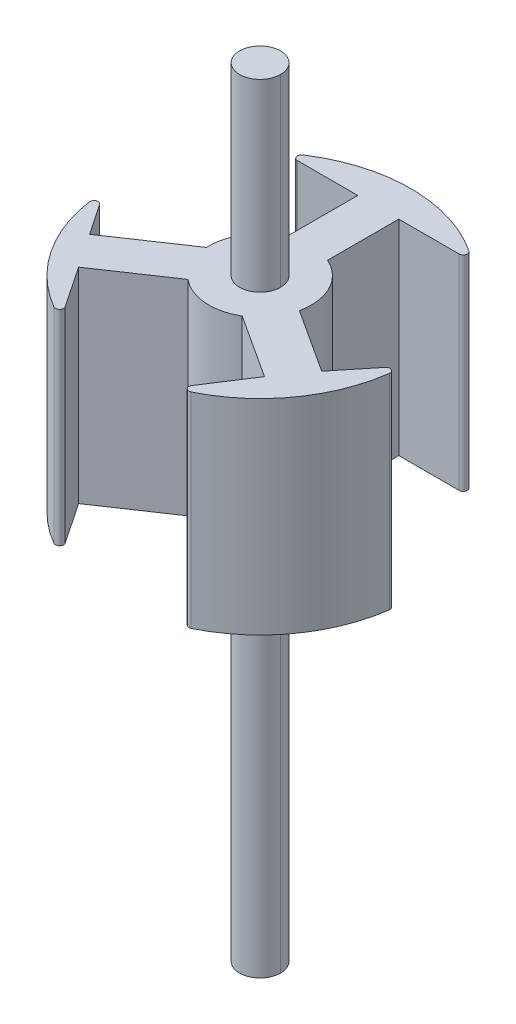
ISO-10303-21;
HEADER;
FILE_DESCRIPTION(('STEP AP214'),'2;1');
FILE_NAME('part.step','',(''),(''),'','','');
FILE_SCHEMA(('AUTOMOTIVE_DESIGN { 1 0 10303 214 1 1 1 1 }'));
ENDSEC;
DATA;
#1=APPLICATION_CONTEXT('core data for automotive mechanical design processes');
#2=APPLICATION_PROTOCOL_DEFINITION('international standard','automotive_design',2000,#1);
#3=PRODUCT_CONTEXT('',#1,'mechanical');
#4=PRODUCT('Part','Part','',(#3));
#5=PRODUCT_RELATED_PRODUCT_CATEGORY('part','',(#4));
#6=PRODUCT_DEFINITION_FORMATION('','',#4);
#7=PRODUCT_DEFINITION_CONTEXT('part definition',#1,'design');
#8=PRODUCT_DEFINITION('design','',#6,#7);
#9=PRODUCT_DEFINITION_SHAPE('','',#8);
#10=(LENGTH_UNIT() NAMED_UNIT(*) SI_UNIT(.MILLI.,.METRE.));
#11=(NAMED_UNIT(*) PLANE_ANGLE_UNIT() SI_UNIT($,.RADIAN.));
#12=(NAMED_UNIT(*) SI_UNIT($,.STERADIAN.) SOLID_ANGLE_UNIT());
#13=UNCERTAINTY_MEASURE_WITH_UNIT(LENGTH_MEASURE(1.E-05),#10,'distance_accuracy_value','');
#14=(GEOMETRIC_REPRESENTATION_CONTEXT(3) GLOBAL_UNCERTAINTY_ASSIGNED_CONTEXT((#13)) GLOBAL_UNIT_ASSIGNED_CONTEXT((#10,
#11,#12)) REPRESENTATION_CONTEXT('',''));
#15=CARTESIAN_POINT('',(0.,0.,0.));
#16=DIRECTION('',(0.,0.,1.));
#17=DIRECTION('',(1.,0.,0.));
#18=AXIS2_PLACEMENT_3D('',#15,#16,#17);
#19=CARTESIAN_POINT('',(0.,19.,0.));
#20=DIRECTION('',(0.,1.,0.));
#21=DIRECTION('',(1.,0.,0.));
#22=AXIS2_PLACEMENT_3D('',#19,#20,#21);
#23=PLANE('',#22);
#24=CARTESIAN_POINT('',(0.,19.,0.));
#25=DIRECTION('',(0.,1.,0.));
#26=DIRECTION('',(-1.,0.,0.));
#27=AXIS2_PLACEMENT_3D('',#24,#25,#26);
#28=CIRCLE('',#27,1.);
#29=CARTESIAN_POINT('',(-1.,19.,0.));
#30=VERTEX_POINT('',#29);
#31=CARTESIAN_POINT('',(1.,19.,0.));
#32=VERTEX_POINT('',#31);
#33=EDGE_CURVE('E11',#30,#32,#28,.T.);
#34=ORIENTED_EDGE('',*,*,#33,.T.);
#35=CARTESIAN_POINT('',(0.,19.,0.));
#36=DIRECTION('',(0.,1.,0.));
#37=DIRECTION('',(1.,0.,0.));
#38=AXIS2_PLACEMENT_3D('',#35,#36,#37);
#39=CIRCLE('',#38,1.);
#40=EDGE_CURVE('E297',#32,#30,#39,.T.);
#41=ORIENTED_EDGE('',*,*,#40,.T.);
#42=EDGE_LOOP('',(#34,#41));
#43=FACE_BOUND('',#42,.T.);
#44=ADVANCED_FACE('F16',(#43),#23,.T.);
#45=CARTESIAN_POINT('',(0.,-19.,0.));
#46=DIRECTION('',(0.,1.,0.));
#47=DIRECTION('',(1.,0.,0.));
#48=AXIS2_PLACEMENT_3D('',#45,#46,#47);
#49=CYLINDRICAL_SURFACE('',#48,1.);
#50=DIRECTION('',(0.,1.,0.));
#51=VECTOR('',#50,1.);
#52=CARTESIAN_POINT('',(1.,10.,0.));
#53=LINE('',#52,#51);
#54=CARTESIAN_POINT('',(1.,10.,0.));
#55=VERTEX_POINT('',#54);
#56=EDGE_CURVE('E301',#55,#32,#53,.T.);
#57=ORIENTED_EDGE('',*,*,#56,.T.);
#58=ORIENTED_EDGE('',*,*,#33,.F.);
#59=DIRECTION('',(0.,1.,0.));
#60=VECTOR('',#59,1.);
#61=CARTESIAN_POINT('',(-1.,10.,0.));
#62=LINE('',#61,#60);
#63=CARTESIAN_POINT('',(-1.,10.,0.));
#64=VERTEX_POINT('',#63);
#65=EDGE_CURVE('E302',#64,#30,#62,.T.);
#66=ORIENTED_EDGE('',*,*,#65,.F.);
#67=CARTESIAN_POINT('',(0.,10.,0.));
#68=DIRECTION('',(0.,1.,0.));
#69=DIRECTION('',(-1.,0.,0.));
#70=AXIS2_PLACEMENT_3D('',#67,#68,#69);
#71=CIRCLE('',#70,1.);
#72=EDGE_CURVE('E27',#64,#55,#71,.T.);
#73=ORIENTED_EDGE('',*,*,#72,.T.);
#74=EDGE_LOOP('',(#57,#58,#66,#73));
#75=FACE_BOUND('',#74,.T.);
#76=ADVANCED_FACE('F756',(#75),#49,.T.);
#77=CARTESIAN_POINT('',(0.,-19.,0.));
#78=DIRECTION('',(0.,1.,0.));
#79=DIRECTION('',(1.,0.,0.));
#80=AXIS2_PLACEMENT_3D('',#77,#78,#79);
#81=CYLINDRICAL_SURFACE('',#80,1.);
#82=DIRECTION('',(0.,1.,0.));
#83=VECTOR('',#82,1.);
#84=CARTESIAN_POINT('',(-1.,-19.,0.));
#85=LINE('',#84,#83);
#86=CARTESIAN_POINT('',(-1.,-19.,0.));
#87=VERTEX_POINT('',#86);
#88=CARTESIAN_POINT('',(-1.,0.,0.));
#89=VERTEX_POINT('',#88);
#90=EDGE_CURVE('E348',#87,#89,#85,.T.);
#91=ORIENTED_EDGE('',*,*,#90,.F.);
#92=CARTESIAN_POINT('',(0.,-19.,0.));
#93=DIRECTION('',(0.,1.,0.));
#94=DIRECTION('',(-1.,0.,0.));
#95=AXIS2_PLACEMENT_3D('',#92,#93,#94);
#96=CIRCLE('',#95,1.);
#97=CARTESIAN_POINT('',(1.,-19.,0.));
#98=VERTEX_POINT('',#97);
#99=EDGE_CURVE('E262',#87,#98,#96,.T.);
#100=ORIENTED_EDGE('',*,*,#99,.T.);
#101=DIRECTION('',(0.,1.,0.));
#102=VECTOR('',#101,1.);
#103=CARTESIAN_POINT('',(1.,-19.,0.));
#104=LINE('',#103,#102);
#105=CARTESIAN_POINT('',(1.,0.,0.));
#106=VERTEX_POINT('',#105);
#107=EDGE_CURVE('E355',#98,#106,#104,.T.);
#108=ORIENTED_EDGE('',*,*,#107,.T.);
#109=CARTESIAN_POINT('',(0.,0.,0.));
#110=DIRECTION('',(0.,1.,0.));
#111=DIRECTION('',(-1.,0.,0.));
#112=AXIS2_PLACEMENT_3D('',#109,#110,#111);
#113=CIRCLE('',#112,1.);
#114=EDGE_CURVE('E271',#89,#106,#113,.T.);
#115=ORIENTED_EDGE('',*,*,#114,.F.);
#116=EDGE_LOOP('',(#91,#100,#108,#115));
#117=FACE_BOUND('',#116,.T.);
#118=ADVANCED_FACE('F735',(#117),#81,.T.);
#119=CARTESIAN_POINT('',(0.,10.,0.));
#120=DIRECTION('',(0.,1.,0.));
#121=DIRECTION('',(1.,0.,0.));
#122=AXIS2_PLACEMENT_3D('',#119,#120,#121);
#123=PLANE('',#122);
#124=ORIENTED_EDGE('',*,*,#72,.F.);
#125=CARTESIAN_POINT('',(0.,10.,0.));
#126=DIRECTION('',(0.,1.,0.));
#127=DIRECTION('',(1.,0.,0.));
#128=AXIS2_PLACEMENT_3D('',#125,#126,#127);
#129=CIRCLE('',#128,1.);
#130=EDGE_CURVE('E287',#55,#64,#129,.T.);
#131=ORIENTED_EDGE('',*,*,#130,.F.);
#132=EDGE_LOOP('',(#124,#131));
#133=FACE_BOUND('',#132,.T.);
#134=DIRECTION('',(-0.82903757255505,0.,0.559192903470734));
#135=VECTOR('',#134,1.);
#136=CARTESIAN_POINT('',(-2.497158797068,10.,0.119155118334));
#137=LINE('',#136,#135);
#138=CARTESIAN_POINT('',(-2.497158797068,10.,0.119155118334));
#139=VERTEX_POINT('',#138);
#140=CARTESIAN_POINT('',(-5.90624692003,10.,2.418614091938));
#141=VERTEX_POINT('',#140);
#142=EDGE_CURVE('E41',#139,#141,#137,.T.);
#143=ORIENTED_EDGE('',*,*,#142,.T.);
#144=DIRECTION('',(-0.559192903470734,0.,-0.82903757255505));
#145=VECTOR('',#144,1.);
#146=CARTESIAN_POINT('',(-5.90624692003,10.,2.418614091938));
#147=LINE('',#146,#145);
#148=CARTESIAN_POINT('',(-6.919840258227,10.,0.9159001707829));
#149=VERTEX_POINT('',#148);
#150=EDGE_CURVE('E399',#141,#149,#147,.T.);
#151=ORIENTED_EDGE('',*,*,#150,.T.);
#152=CARTESIAN_POINT('',(-7.085647772738,10.,1.027738751477));
#153=DIRECTION('',(0.,1.,0.));
#154=DIRECTION('',(0.82903757255505,0.,-0.559192903470734));
#155=AXIS2_PLACEMENT_3D('',#152,#153,#154);
#156=CIRCLE('',#155,0.2);
#157=CARTESIAN_POINT('',(-7.283576587207,10.,1.056447363475));
#158=VERTEX_POINT('',#157);
#159=EDGE_CURVE('E465',#149,#158,#156,.T.);
#160=ORIENTED_EDGE('',*,*,#159,.T.);
#161=CARTESIAN_POINT('',(0.,10.,0.));
#162=DIRECTION('',(0.,1.,0.));
#163=DIRECTION('',(-0.989644072345388,0.,0.143543059991198));
#164=AXIS2_PLACEMENT_3D('',#161,#162,#163);
#165=CIRCLE('',#164,7.359794082276);
#166=CARTESIAN_POINT('',(-3.707996751831,10.,6.357462467204));
#167=VERTEX_POINT('',#166);
#168=EDGE_CURVE('E353',#158,#167,#165,.T.);
#169=ORIENTED_EDGE('',*,*,#168,.T.);
#170=CARTESIAN_POINT('',(-3.607233151373,10.,6.184700501417));
#171=DIRECTION('',(0.,1.,0.));
#172=DIRECTION('',(-0.503818002294489,0.,0.863809828934581));
#173=AXIS2_PLACEMENT_3D('',#170,#171,#172);
#174=CIRCLE('',#173,0.2);
#175=CARTESIAN_POINT('',(-3.441425636862,10.,6.072861920723));
#176=VERTEX_POINT('',#175);
#177=EDGE_CURVE('E354',#167,#176,#174,.T.);
#178=ORIENTED_EDGE('',*,*,#177,.T.);
#179=DIRECTION('',(-0.559192903470734,0.,-0.82903757255505));
#180=VECTOR('',#179,1.);
#181=CARTESIAN_POINT('',(-3.441425636862,10.,6.072861920723));
#182=LINE('',#181,#180);
#183=CARTESIAN_POINT('',(-4.787861113089,10.,4.076689237048));
#184=VERTEX_POINT('',#183);
#185=EDGE_CURVE('E438',#176,#184,#182,.T.);
#186=ORIENTED_EDGE('',*,*,#185,.T.);
#187=DIRECTION('',(0.82903757255505,0.,-0.559192903470734));
#188=VECTOR('',#187,1.);
#189=CARTESIAN_POINT('',(-4.787861113089,10.,4.076689237048));
#190=LINE('',#189,#188);
#191=CARTESIAN_POINT('',(-1.596339216938,10.,1.923980536405));
#192=VERTEX_POINT('',#191);
#193=EDGE_CURVE('E343',#184,#192,#190,.T.);
#194=ORIENTED_EDGE('',*,*,#193,.T.);
#195=CARTESIAN_POINT('',(0.,10.,0.));
#196=DIRECTION('',(0.,1.,0.));
#197=DIRECTION('',(-0.638535686775068,0.,0.769592214562162));
#198=AXIS2_PLACEMENT_3D('',#195,#196,#197);
#199=CIRCLE('',#198,2.5);
#200=CARTESIAN_POINT('',(1.275876665121,10.,2.149915983335));
#201=VERTEX_POINT('',#200);
#202=EDGE_CURVE('E344',#192,#201,#199,.T.);
#203=ORIENTED_EDGE('',*,*,#202,.T.);
#204=DIRECTION('',(0.838670567945429,0.,0.544639035015019));
#205=VECTOR('',#204,1.);
#206=CARTESIAN_POINT('',(1.275876665121,10.,2.149915983335));
#207=LINE('',#206,#205);
#208=CARTESIAN_POINT('',(4.382924026397,10.,4.167656132172));
#209=VERTEX_POINT('',#208);
#210=EDGE_CURVE('E258',#201,#209,#207,.T.);
#211=ORIENTED_EDGE('',*,*,#210,.T.);
#212=DIRECTION('',(-0.544639035015019,0.,0.838670567945429));
#213=VECTOR('',#212,1.);
#214=CARTESIAN_POINT('',(4.382924026397,10.,4.167656132172));
#215=LINE('',#214,#213);
#216=CARTESIAN_POINT('',(2.985864983518,10.,6.318938404682));
#217=VERTEX_POINT('',#216);
#218=EDGE_CURVE('E253',#209,#217,#215,.T.);
#219=ORIENTED_EDGE('',*,*,#218,.T.);
#220=CARTESIAN_POINT('',(3.153599097107,10.,6.427866211685));
#221=DIRECTION('',(0.,1.,0.));
#222=DIRECTION('',(-0.838670567945429,0.,-0.544639035015019));
#223=AXIS2_PLACEMENT_3D('',#220,#221,#222);
#224=CIRCLE('',#223,0.2);
#225=CARTESIAN_POINT('',(3.241690990837,10.,6.607420711097));
#226=VERTEX_POINT('',#225);
#227=EDGE_CURVE('E245',#217,#226,#224,.T.);
#228=ORIENTED_EDGE('',*,*,#227,.T.);
#229=CARTESIAN_POINT('',(0.,10.,0.));
#230=DIRECTION('',(0.,1.,0.));
#231=DIRECTION('',(0.440459468647816,0.,0.897772497060633));
#232=AXIS2_PLACEMENT_3D('',#229,#230,#231);
#233=CIRCLE('',#232,7.359794082276);
#234=CARTESIAN_POINT('',(7.294437549223,10.,0.9786469097615));
#235=VERTEX_POINT('',#234);
#236=EDGE_CURVE('E246',#226,#235,#233,.T.);
#237=ORIENTED_EDGE('',*,*,#236,.T.);
#238=CARTESIAN_POINT('',(7.096213591659,10.,0.9520524996783));
#239=DIRECTION('',(0.,1.,0.));
#240=DIRECTION('',(0.991119787819861,0.,0.132972050416295));
#241=AXIS2_PLACEMENT_3D('',#238,#239,#240);
#242=CIRCLE('',#241,0.2);
#243=CARTESIAN_POINT('',(6.940784399368,10.,0.8261884214683));
#244=VERTEX_POINT('',#243);
#245=EDGE_CURVE('E292',#235,#244,#242,.T.);
#246=ORIENTED_EDGE('',*,*,#245,.T.);
#247=DIRECTION('',(-0.629320391049801,0.,0.777145961457001));
#248=VECTOR('',#247,1.);
#249=CARTESIAN_POINT('',(6.940784399368,10.,0.8261884214683));
#250=LINE('',#249,#248);
#251=CARTESIAN_POINT('',(5.55150006309,10.,2.541811697957));
#252=VERTEX_POINT('',#251);
#253=EDGE_CURVE('E395',#244,#252,#250,.T.);
#254=ORIENTED_EDGE('',*,*,#253,.T.);
#255=DIRECTION('',(-0.838670567945429,0.,-0.544639035015019));
#256=VECTOR('',#255,1.);
#257=CARTESIAN_POINT('',(5.55150006309,10.,2.541811697957));
#258=LINE('',#257,#256);
#259=CARTESIAN_POINT('',(2.444452701813,10.,0.5240715491201));
#260=VERTEX_POINT('',#259);
#261=EDGE_CURVE('E316',#252,#260,#258,.T.);
#262=ORIENTED_EDGE('',*,*,#261,.T.);
#263=CARTESIAN_POINT('',(0.,10.,0.));
#264=DIRECTION('',(0.,1.,0.));
#265=DIRECTION('',(0.977781080725372,0.,0.209628619647994));
#266=AXIS2_PLACEMENT_3D('',#263,#264,#265);
#267=CIRCLE('',#266,2.5);
#268=CARTESIAN_POINT('',(1.000960954439,10.,-2.290868212641));
#269=VERTEX_POINT('',#268);
#270=EDGE_CURVE('E311',#260,#269,#267,.T.);
#271=ORIENTED_EDGE('',*,*,#270,.T.);
#272=DIRECTION('',(0.,0.,-1.));
#273=VECTOR('',#272,1.);
#274=CARTESIAN_POINT('',(1.000960954439,10.,-2.290868212641));
#275=LINE('',#274,#273);
#276=CARTESIAN_POINT('',(1.000960954439,10.,-5.77152815662));
#277=VERTEX_POINT('',#276);
#278=EDGE_CURVE('E204',#269,#277,#275,.T.);
#279=ORIENTED_EDGE('',*,*,#278,.T.);
#280=DIRECTION('',(1.,0.,0.));
#281=VECTOR('',#280,1.);
#282=CARTESIAN_POINT('',(1.000960954439,10.,-5.77152815662));
#283=LINE('',#282,#281);
#284=CARTESIAN_POINT('',(3.950126931542,10.,-5.77152815662));
#285=VERTEX_POINT('',#284);
#286=EDGE_CURVE('E209',#277,#285,#283,.T.);
#287=ORIENTED_EDGE('',*,*,#286,.T.);
#288=CARTESIAN_POINT('',(3.950126931542,10.,-5.97152815662));
#289=DIRECTION('',(0.,1.,0.));
#290=DIRECTION('',(0.,0.,1.));
#291=AXIS2_PLACEMENT_3D('',#288,#289,#290);
#292=CIRCLE('',#291,0.2);
#293=CARTESIAN_POINT('',(4.06046884602,10.,-6.138335416382));
#294=VERTEX_POINT('',#293);
#295=EDGE_CURVE('E214',#285,#294,#292,.T.);
#296=ORIENTED_EDGE('',*,*,#295,.T.);
#297=CARTESIAN_POINT('',(0.,10.,0.));
#298=DIRECTION('',(0.,1.,0.));
#299=DIRECTION('',(0.551709572391219,0.,-0.834036298809529));
#300=AXIS2_PLACEMENT_3D('',#297,#298,#299);
#301=CIRCLE('',#300,7.359794082276);
#302=CARTESIAN_POINT('',(-4.06046884602,10.,-6.138335416382));
#303=VERTEX_POINT('',#302);
#304=EDGE_CURVE('E239',#294,#303,#301,.T.);
#305=ORIENTED_EDGE('',*,*,#304,.T.);
#306=CARTESIAN_POINT('',(-3.950126931542,10.,-5.97152815662));
#307=DIRECTION('',(0.,1.,0.));
#308=DIRECTION('',(-0.551709572391219,0.,-0.834036298809529));
#309=AXIS2_PLACEMENT_3D('',#306,#307,#308);
#310=CIRCLE('',#309,0.2);
#311=CARTESIAN_POINT('',(-3.950126931542,10.,-5.77152815662));
#312=VERTEX_POINT('',#311);
#313=EDGE_CURVE('E417',#303,#312,#310,.T.);
#314=ORIENTED_EDGE('',*,*,#313,.T.);
#315=DIRECTION('',(1.,0.,0.));
#316=VECTOR('',#315,1.);
#317=CARTESIAN_POINT('',(-3.950126931542,10.,-5.77152815662));
#318=LINE('',#317,#316);
#319=CARTESIAN_POINT('',(-1.000960954439,10.,-5.77152815662));
#320=VERTEX_POINT('',#319);
#321=EDGE_CURVE('E418',#312,#320,#318,.T.);
#322=ORIENTED_EDGE('',*,*,#321,.T.);
#323=DIRECTION('',(0.,0.,1.));
#324=VECTOR('',#323,1.);
#325=CARTESIAN_POINT('',(-1.000960954439,10.,-5.77152815662));
#326=LINE('',#325,#324);
#327=CARTESIAN_POINT('',(-1.000960954439,10.,-2.290868212641));
#328=VERTEX_POINT('',#327);
#329=EDGE_CURVE('E252',#320,#328,#326,.T.);
#330=ORIENTED_EDGE('',*,*,#329,.T.);
#331=CARTESIAN_POINT('',(0.,10.,0.));
#332=DIRECTION('',(0.,1.,0.));
#333=DIRECTION('',(-0.400384381775791,0.,-0.916347285056281));
#334=AXIS2_PLACEMENT_3D('',#331,#332,#333);
#335=CIRCLE('',#334,2.5);
#336=EDGE_CURVE('E20',#328,#139,#335,.T.);
#337=ORIENTED_EDGE('',*,*,#336,.T.);
#338=EDGE_LOOP('',(#143,#151,#160,#169,#178,#186,#194,#203,#211,#219,#228,#237,#246,#254,#262,
#271,#279,#287,#296,#305,#314,#322,#330,#337));
#339=FACE_BOUND('',#338,.T.);
#340=ADVANCED_FACE('F211',(#133,#339),#123,.T.);
#341=CARTESIAN_POINT('',(-2.497158797068,0.,0.119155118334));
#342=DIRECTION('',(-0.559192903470734,0.,-0.82903757255505));
#343=DIRECTION('',(-0.82903757255505,0.,0.559192903470734));
#344=AXIS2_PLACEMENT_3D('',#341,#342,#343);
#345=PLANE('',#344);
#346=DIRECTION('',(0.,1.,0.));
#347=VECTOR('',#346,1.);
#348=CARTESIAN_POINT('',(-5.90624692003,0.,2.418614091938));
#349=LINE('',#348,#347);
#350=CARTESIAN_POINT('',(-5.90624692003,0.,2.418614091938));
#351=VERTEX_POINT('',#350);
#352=EDGE_CURVE('E322',#351,#141,#349,.T.);
#353=ORIENTED_EDGE('',*,*,#352,.T.);
#354=ORIENTED_EDGE('',*,*,#142,.F.);
#355=DIRECTION('',(0.,1.,0.));
#356=VECTOR('',#355,1.);
#357=CARTESIAN_POINT('',(-2.497158797068,0.,0.119155118334));
#358=LINE('',#357,#356);
#359=CARTESIAN_POINT('',(-2.497158797068,0.,0.119155118334));
#360=VERTEX_POINT('',#359);
#361=EDGE_CURVE('E411',#360,#139,#358,.T.);
#362=ORIENTED_EDGE('',*,*,#361,.F.);
#363=DIRECTION('',(-0.82903757255505,0.,0.559192903470734));
#364=VECTOR('',#363,1.);
#365=CARTESIAN_POINT('',(-2.497158797068,0.,0.119155118334));
#366=LINE('',#365,#364);
#367=EDGE_CURVE('E272',#360,#351,#366,.T.);
#368=ORIENTED_EDGE('',*,*,#367,.T.);
#369=EDGE_LOOP('',(#353,#354,#362,#368));
#370=FACE_BOUND('',#369,.T.);
#371=ADVANCED_FACE('F649',(#370),#345,.T.);
#372=CARTESIAN_POINT('',(-5.90624692003,0.,2.418614091938));
#373=DIRECTION('',(0.82903757255505,0.,-0.559192903470734));
#374=DIRECTION('',(0.,-1.,0.));
#375=AXIS2_PLACEMENT_3D('',#372,#373,#374);
#376=PLANE('',#375);
#377=DIRECTION('',(0.,1.,0.));
#378=VECTOR('',#377,1.);
#379=CARTESIAN_POINT('',(-6.919840258227,0.,0.9159001707829));
#380=LINE('',#379,#378);
#381=CARTESIAN_POINT('',(-6.919840258227,0.,0.9159001707829));
#382=VERTEX_POINT('',#381);
#383=EDGE_CURVE('E402',#382,#149,#380,.T.);
#384=ORIENTED_EDGE('',*,*,#383,.T.);
#385=ORIENTED_EDGE('',*,*,#150,.F.);
#386=ORIENTED_EDGE('',*,*,#352,.F.);
#387=DIRECTION('',(-0.559192903470734,0.,-0.82903757255505));
#388=VECTOR('',#387,1.);
#389=CARTESIAN_POINT('',(-5.90624692003,0.,2.418614091938));
#390=LINE('',#389,#388);
#391=EDGE_CURVE('E449',#351,#382,#390,.T.);
#392=ORIENTED_EDGE('',*,*,#391,.T.);
#393=EDGE_LOOP('',(#384,#385,#386,#392));
#394=FACE_BOUND('',#393,.T.);
#395=ADVANCED_FACE('F647',(#394),#376,.T.);
#396=CARTESIAN_POINT('',(-7.085647772738,0.,1.027738751477));
#397=DIRECTION('',(0.,1.,0.));
#398=DIRECTION('',(1.,0.,0.));
#399=AXIS2_PLACEMENT_3D('',#396,#397,#398);
#400=CYLINDRICAL_SURFACE('',#399,0.2);
#401=DIRECTION('',(0.,1.,0.));
#402=VECTOR('',#401,1.);
#403=CARTESIAN_POINT('',(-7.283576587207,0.,1.056447363475));
#404=LINE('',#403,#402);
#405=CARTESIAN_POINT('',(-7.283576587207,0.,1.056447363475));
#406=VERTEX_POINT('',#405);
#407=EDGE_CURVE('E462',#406,#158,#404,.T.);
#408=ORIENTED_EDGE('',*,*,#407,.T.);
#409=ORIENTED_EDGE('',*,*,#159,.F.);
#410=ORIENTED_EDGE('',*,*,#383,.F.);
#411=CARTESIAN_POINT('',(-7.085647772738,0.,1.027738751477));
#412=DIRECTION('',(0.,1.,0.));
#413=DIRECTION('',(0.82903757255505,0.,-0.559192903470734));
#414=AXIS2_PLACEMENT_3D('',#411,#412,#413);
#415=CIRCLE('',#414,0.2);
#416=EDGE_CURVE('E330',#382,#406,#415,.T.);
#417=ORIENTED_EDGE('',*,*,#416,.T.);
#418=EDGE_LOOP('',(#408,#409,#410,#417));
#419=FACE_BOUND('',#418,.T.);
#420=ADVANCED_FACE('F642',(#419),#400,.T.);
#421=CARTESIAN_POINT('',(0.,0.,0.));
#422=DIRECTION('',(0.,1.,0.));
#423=DIRECTION('',(1.,0.,0.));
#424=AXIS2_PLACEMENT_3D('',#421,#422,#423);
#425=CYLINDRICAL_SURFACE('',#424,7.359794082276);
#426=DIRECTION('',(0.,1.,0.));
#427=VECTOR('',#426,1.);
#428=CARTESIAN_POINT('',(-3.707996751831,0.,6.357462467204));
#429=LINE('',#428,#427);
#430=CARTESIAN_POINT('',(-3.707996751831,0.,6.357462467204));
#431=VERTEX_POINT('',#430);
#432=EDGE_CURVE('E349',#431,#167,#429,.T.);
#433=ORIENTED_EDGE('',*,*,#432,.T.);
#434=ORIENTED_EDGE('',*,*,#168,.F.);
#435=ORIENTED_EDGE('',*,*,#407,.F.);
#436=CARTESIAN_POINT('',(0.,0.,0.));
#437=DIRECTION('',(0.,1.,0.));
#438=DIRECTION('',(-0.989644072345388,0.,0.143543059991198));
#439=AXIS2_PLACEMENT_3D('',#436,#437,#438);
#440=CIRCLE('',#439,7.359794082276);
#441=EDGE_CURVE('E280',#406,#431,#440,.T.);
#442=ORIENTED_EDGE('',*,*,#441,.T.);
#443=EDGE_LOOP('',(#433,#434,#435,#442));
#444=FACE_BOUND('',#443,.T.);
#445=ADVANCED_FACE('F637',(#444),#425,.T.);
#446=CARTESIAN_POINT('',(-3.607233151373,0.,6.184700501417));
#447=DIRECTION('',(0.,1.,0.));
#448=DIRECTION('',(1.,0.,0.));
#449=AXIS2_PLACEMENT_3D('',#446,#447,#448);
#450=CYLINDRICAL_SURFACE('',#449,0.2);
#451=DIRECTION('',(0.,1.,0.));
#452=VECTOR('',#451,1.);
#453=CARTESIAN_POINT('',(-3.441425636862,0.,6.072861920723));
#454=LINE('',#453,#452);
#455=CARTESIAN_POINT('',(-3.441425636862,0.,6.072861920723));
#456=VERTEX_POINT('',#455);
#457=EDGE_CURVE('E440',#456,#176,#454,.T.);
#458=ORIENTED_EDGE('',*,*,#457,.T.);
#459=ORIENTED_EDGE('',*,*,#177,.F.);
#460=ORIENTED_EDGE('',*,*,#432,.F.);
#461=CARTESIAN_POINT('',(-3.607233151373,0.,6.184700501417));
#462=DIRECTION('',(0.,1.,0.));
#463=DIRECTION('',(-0.503818002294489,0.,0.863809828934581));
#464=AXIS2_PLACEMENT_3D('',#461,#462,#463);
#465=CIRCLE('',#464,0.2);
#466=EDGE_CURVE('E276',#431,#456,#465,.T.);
#467=ORIENTED_EDGE('',*,*,#466,.T.);
#468=EDGE_LOOP('',(#458,#459,#460,#467));
#469=FACE_BOUND('',#468,.T.);
#470=ADVANCED_FACE('F634',(#469),#450,.T.);
#471=CARTESIAN_POINT('',(-3.441425636862,0.,6.072861920723));
#472=DIRECTION('',(0.82903757255505,0.,-0.559192903470734));
#473=DIRECTION('',(0.,-1.,0.));
#474=AXIS2_PLACEMENT_3D('',#471,#472,#473);
#475=PLANE('',#474);
#476=DIRECTION('',(0.,1.,0.));
#477=VECTOR('',#476,1.);
#478=CARTESIAN_POINT('',(-4.787861113089,0.,4.076689237048));
#479=LINE('',#478,#477);
#480=CARTESIAN_POINT('',(-4.787861113089,0.,4.076689237048));
#481=VERTEX_POINT('',#480);
#482=EDGE_CURVE('E596',#481,#184,#479,.T.);
#483=ORIENTED_EDGE('',*,*,#482,.T.);
#484=ORIENTED_EDGE('',*,*,#185,.F.);
#485=ORIENTED_EDGE('',*,*,#457,.F.);
#486=DIRECTION('',(-0.559192903470734,0.,-0.82903757255505));
#487=VECTOR('',#486,1.);
#488=CARTESIAN_POINT('',(-3.441425636862,0.,6.072861920723));
#489=LINE('',#488,#487);
#490=EDGE_CURVE('E281',#456,#481,#489,.T.);
#491=ORIENTED_EDGE('',*,*,#490,.T.);
#492=EDGE_LOOP('',(#483,#484,#485,#491));
#493=FACE_BOUND('',#492,.T.);
#494=ADVANCED_FACE('F630',(#493),#475,.T.);
#495=CARTESIAN_POINT('',(-4.787861113089,0.,4.076689237048));
#496=DIRECTION('',(0.559192903470734,0.,0.82903757255505));
#497=DIRECTION('',(0.,-1.,0.));
#498=AXIS2_PLACEMENT_3D('',#495,#496,#497);
#499=PLANE('',#498);
#500=DIRECTION('',(0.,1.,0.));
#501=VECTOR('',#500,1.);
#502=CARTESIAN_POINT('',(-1.596339216938,0.,1.923980536405));
#503=LINE('',#502,#501);
#504=CARTESIAN_POINT('',(-1.596339216938,0.,1.923980536405));
#505=VERTEX_POINT('',#504);
#506=EDGE_CURVE('E339',#505,#192,#503,.T.);
#507=ORIENTED_EDGE('',*,*,#506,.T.);
#508=ORIENTED_EDGE('',*,*,#193,.F.);
#509=ORIENTED_EDGE('',*,*,#482,.F.);
#510=DIRECTION('',(0.82903757255505,0.,-0.559192903470734));
#511=VECTOR('',#510,1.);
#512=CARTESIAN_POINT('',(-4.787861113089,0.,4.076689237048));
#513=LINE('',#512,#511);
#514=EDGE_CURVE('E296',#481,#505,#513,.T.);
#515=ORIENTED_EDGE('',*,*,#514,.T.);
#516=EDGE_LOOP('',(#507,#508,#509,#515));
#517=FACE_BOUND('',#516,.T.);
#518=ADVANCED_FACE('F625',(#517),#499,.T.);
#519=CARTESIAN_POINT('',(0.,0.,0.));
#520=DIRECTION('',(0.,1.,0.));
#521=DIRECTION('',(1.,0.,0.));
#522=AXIS2_PLACEMENT_3D('',#519,#520,#521);
#523=CYLINDRICAL_SURFACE('',#522,2.5);
#524=DIRECTION('',(0.,1.,0.));
#525=VECTOR('',#524,1.);
#526=CARTESIAN_POINT('',(1.275876665121,0.,2.149915983335));
#527=LINE('',#526,#525);
#528=CARTESIAN_POINT('',(1.275876665121,0.,2.149915983335));
#529=VERTEX_POINT('',#528);
#530=EDGE_CURVE('E261',#529,#201,#527,.T.);
#531=ORIENTED_EDGE('',*,*,#530,.T.);
#532=ORIENTED_EDGE('',*,*,#202,.F.);
#533=ORIENTED_EDGE('',*,*,#506,.F.);
#534=CARTESIAN_POINT('',(0.,0.,0.));
#535=DIRECTION('',(0.,1.,0.));
#536=DIRECTION('',(-0.638535686775068,0.,0.769592214562162));
#537=AXIS2_PLACEMENT_3D('',#534,#535,#536);
#538=CIRCLE('',#537,2.5);
#539=EDGE_CURVE('E461',#505,#529,#538,.T.);
#540=ORIENTED_EDGE('',*,*,#539,.T.);
#541=EDGE_LOOP('',(#531,#532,#533,#540));
#542=FACE_BOUND('',#541,.T.);
#543=ADVANCED_FACE('F622',(#542),#523,.T.);
#544=CARTESIAN_POINT('',(1.275876665121,0.,2.149915983335));
#545=DIRECTION('',(-0.544639035015019,0.,0.838670567945429));
#546=DIRECTION('',(0.,1.,0.));
#547=AXIS2_PLACEMENT_3D('',#544,#545,#546);
#548=PLANE('',#547);
#549=DIRECTION('',(0.,1.,0.));
#550=VECTOR('',#549,1.);
#551=CARTESIAN_POINT('',(4.382924026397,0.,4.167656132172));
#552=LINE('',#551,#550);
#553=CARTESIAN_POINT('',(4.382924026397,0.,4.167656132172));
#554=VERTEX_POINT('',#553);
#555=EDGE_CURVE('E256',#554,#209,#552,.T.);
#556=ORIENTED_EDGE('',*,*,#555,.T.);
#557=ORIENTED_EDGE('',*,*,#210,.F.);
#558=ORIENTED_EDGE('',*,*,#530,.F.);
#559=DIRECTION('',(0.838670567945429,0.,0.544639035015019));
#560=VECTOR('',#559,1.);
#561=CARTESIAN_POINT('',(1.275876665121,0.,2.149915983335));
#562=LINE('',#561,#560);
#563=EDGE_CURVE('E470',#529,#554,#562,.T.);
#564=ORIENTED_EDGE('',*,*,#563,.T.);
#565=EDGE_LOOP('',(#556,#557,#558,#564));
#566=FACE_BOUND('',#565,.T.);
#567=ADVANCED_FACE('F621',(#566),#548,.T.);
#568=CARTESIAN_POINT('',(4.382924026397,0.,4.167656132172));
#569=DIRECTION('',(-0.838670567945429,0.,-0.544639035015019));
#570=DIRECTION('',(-0.544639035015019,0.,0.838670567945429));
#571=AXIS2_PLACEMENT_3D('',#568,#569,#570);
#572=PLANE('',#571);
#573=DIRECTION('',(0.,1.,0.));
#574=VECTOR('',#573,1.);
#575=CARTESIAN_POINT('',(2.985864983518,0.,6.318938404682));
#576=LINE('',#575,#574);
#577=CARTESIAN_POINT('',(2.985864983518,0.,6.318938404682));
#578=VERTEX_POINT('',#577);
#579=EDGE_CURVE('E257',#578,#217,#576,.T.);
#580=ORIENTED_EDGE('',*,*,#579,.T.);
#581=ORIENTED_EDGE('',*,*,#218,.F.);
#582=ORIENTED_EDGE('',*,*,#555,.F.);
#583=DIRECTION('',(-0.544639035015019,0.,0.838670567945429));
#584=VECTOR('',#583,1.);
#585=CARTESIAN_POINT('',(4.382924026397,0.,4.167656132172));
#586=LINE('',#585,#584);
#587=EDGE_CURVE('E388',#554,#578,#586,.T.);
#588=ORIENTED_EDGE('',*,*,#587,.T.);
#589=EDGE_LOOP('',(#580,#581,#582,#588));
#590=FACE_BOUND('',#589,.T.);
#591=ADVANCED_FACE('F616',(#590),#572,.T.);
#592=CARTESIAN_POINT('',(3.153599097107,0.,6.427866211685));
#593=DIRECTION('',(0.,1.,0.));
#594=DIRECTION('',(1.,0.,0.));
#595=AXIS2_PLACEMENT_3D('',#592,#593,#594);
#596=CYLINDRICAL_SURFACE('',#595,0.2);
#597=DIRECTION('',(0.,1.,0.));
#598=VECTOR('',#597,1.);
#599=CARTESIAN_POINT('',(3.241690990837,0.,6.607420711097));
#600=LINE('',#599,#598);
#601=CARTESIAN_POINT('',(3.241690990837,0.,6.607420711097));
#602=VERTEX_POINT('',#601);
#603=EDGE_CURVE('E243',#602,#226,#600,.T.);
#604=ORIENTED_EDGE('',*,*,#603,.T.);
#605=ORIENTED_EDGE('',*,*,#227,.F.);
#606=ORIENTED_EDGE('',*,*,#579,.F.);
#607=CARTESIAN_POINT('',(3.153599097107,0.,6.427866211685));
#608=DIRECTION('',(0.,1.,0.));
#609=DIRECTION('',(-0.838670567945429,0.,-0.544639035015019));
#610=AXIS2_PLACEMENT_3D('',#607,#608,#609);
#611=CIRCLE('',#610,0.2);
#612=EDGE_CURVE('E384',#578,#602,#611,.T.);
#613=ORIENTED_EDGE('',*,*,#612,.T.);
#614=EDGE_LOOP('',(#604,#605,#606,#613));
#615=FACE_BOUND('',#614,.T.);
#616=ADVANCED_FACE('F613',(#615),#596,.T.);
#617=CARTESIAN_POINT('',(0.,0.,0.));
#618=DIRECTION('',(0.,1.,0.));
#619=DIRECTION('',(1.,0.,0.));
#620=AXIS2_PLACEMENT_3D('',#617,#618,#619);
#621=CYLINDRICAL_SURFACE('',#620,7.359794082276);
#622=DIRECTION('',(0.,1.,0.));
#623=VECTOR('',#622,1.);
#624=CARTESIAN_POINT('',(7.294437549223,0.,0.9786469097615));
#625=LINE('',#624,#623);
#626=CARTESIAN_POINT('',(7.294437549223,0.,0.9786469097615));
#627=VERTEX_POINT('',#626);
#628=EDGE_CURVE('E288',#627,#235,#625,.T.);
#629=ORIENTED_EDGE('',*,*,#628,.T.);
#630=ORIENTED_EDGE('',*,*,#236,.F.);
#631=ORIENTED_EDGE('',*,*,#603,.F.);
#632=CARTESIAN_POINT('',(0.,0.,0.));
#633=DIRECTION('',(0.,1.,0.));
#634=DIRECTION('',(0.440459468647816,0.,0.897772497060633));
#635=AXIS2_PLACEMENT_3D('',#632,#633,#634);
#636=CIRCLE('',#635,7.359794082276);
#637=EDGE_CURVE('E382',#602,#627,#636,.T.);
#638=ORIENTED_EDGE('',*,*,#637,.T.);
#639=EDGE_LOOP('',(#629,#630,#631,#638));
#640=FACE_BOUND('',#639,.T.);
#641=ADVANCED_FACE('F609',(#640),#621,.T.);
#642=CARTESIAN_POINT('',(7.096213591659,0.,0.9520524996783));
#643=DIRECTION('',(0.,1.,0.));
#644=DIRECTION('',(1.,0.,0.));
#645=AXIS2_PLACEMENT_3D('',#642,#643,#644);
#646=CYLINDRICAL_SURFACE('',#645,0.2);
#647=DIRECTION('',(0.,1.,0.));
#648=VECTOR('',#647,1.);
#649=CARTESIAN_POINT('',(6.940784399368,0.,0.8261884214683));
#650=LINE('',#649,#648);
#651=CARTESIAN_POINT('',(6.940784399368,0.,0.8261884214683));
#652=VERTEX_POINT('',#651);
#653=EDGE_CURVE('E374',#652,#244,#650,.T.);
#654=ORIENTED_EDGE('',*,*,#653,.T.);
#655=ORIENTED_EDGE('',*,*,#245,.F.);
#656=ORIENTED_EDGE('',*,*,#628,.F.);
#657=CARTESIAN_POINT('',(7.096213591659,0.,0.9520524996783));
#658=DIRECTION('',(0.,1.,0.));
#659=DIRECTION('',(0.991119787819861,0.,0.132972050416295));
#660=AXIS2_PLACEMENT_3D('',#657,#658,#659);
#661=CIRCLE('',#660,0.2);
#662=EDGE_CURVE('E378',#627,#652,#661,.T.);
#663=ORIENTED_EDGE('',*,*,#662,.T.);
#664=EDGE_LOOP('',(#654,#655,#656,#663));
#665=FACE_BOUND('',#664,.T.);
#666=ADVANCED_FACE('F522',(#665),#646,.T.);
#667=CARTESIAN_POINT('',(6.940784399368,0.,0.8261884214683));
#668=DIRECTION('',(-0.777145961457001,0.,-0.629320391049801));
#669=DIRECTION('',(-0.629320391049801,0.,0.777145961457001));
#670=AXIS2_PLACEMENT_3D('',#667,#668,#669);
#671=PLANE('',#670);
#672=DIRECTION('',(0.,1.,0.));
#673=VECTOR('',#672,1.);
#674=CARTESIAN_POINT('',(5.55150006309,0.,2.541811697957));
#675=LINE('',#674,#673);
#676=CARTESIAN_POINT('',(5.55150006309,0.,2.541811697957));
#677=VERTEX_POINT('',#676);
#678=EDGE_CURVE('E319',#677,#252,#675,.T.);
#679=ORIENTED_EDGE('',*,*,#678,.T.);
#680=ORIENTED_EDGE('',*,*,#253,.F.);
#681=ORIENTED_EDGE('',*,*,#653,.F.);
#682=DIRECTION('',(-0.629320391049801,0.,0.777145961457001));
#683=VECTOR('',#682,1.);
#684=CARTESIAN_POINT('',(6.940784399368,0.,0.8261884214683));
#685=LINE('',#684,#683);
#686=EDGE_CURVE('E383',#652,#677,#685,.T.);
#687=ORIENTED_EDGE('',*,*,#686,.T.);
#688=EDGE_LOOP('',(#679,#680,#681,#687));
#689=FACE_BOUND('',#688,.T.);
#690=ADVANCED_FACE('F527',(#689),#671,.T.);
#691=CARTESIAN_POINT('',(5.55150006309,0.,2.541811697957));
#692=DIRECTION('',(0.544639035015019,0.,-0.838670567945429));
#693=DIRECTION('',(0.,-1.,0.));
#694=AXIS2_PLACEMENT_3D('',#691,#692,#693);
#695=PLANE('',#694);
#696=DIRECTION('',(0.,1.,0.));
#697=VECTOR('',#696,1.);
#698=CARTESIAN_POINT('',(2.444452701813,0.,0.5240715491201));
#699=LINE('',#698,#697);
#700=CARTESIAN_POINT('',(2.444452701813,0.,0.5240715491201));
#701=VERTEX_POINT('',#700);
#702=EDGE_CURVE('E314',#701,#260,#699,.T.);
#703=ORIENTED_EDGE('',*,*,#702,.T.);
#704=ORIENTED_EDGE('',*,*,#261,.F.);
#705=ORIENTED_EDGE('',*,*,#678,.F.);
#706=DIRECTION('',(-0.838670567945429,0.,-0.544639035015019));
#707=VECTOR('',#706,1.);
#708=CARTESIAN_POINT('',(5.55150006309,0.,2.541811697957));
#709=LINE('',#708,#707);
#710=EDGE_CURVE('E501',#677,#701,#709,.T.);
#711=ORIENTED_EDGE('',*,*,#710,.T.);
#712=EDGE_LOOP('',(#703,#704,#705,#711));
#713=FACE_BOUND('',#712,.T.);
#714=ADVANCED_FACE('F575',(#713),#695,.T.);
#715=CARTESIAN_POINT('',(0.,0.,0.));
#716=DIRECTION('',(0.,1.,0.));
#717=DIRECTION('',(1.,0.,0.));
#718=AXIS2_PLACEMENT_3D('',#715,#716,#717);
#719=CYLINDRICAL_SURFACE('',#718,2.5);
#720=DIRECTION('',(0.,1.,0.));
#721=VECTOR('',#720,1.);
#722=CARTESIAN_POINT('',(1.000960954439,0.,-2.290868212641));
#723=LINE('',#722,#721);
#724=CARTESIAN_POINT('',(1.000960954439,0.,-2.290868212641));
#725=VERTEX_POINT('',#724);
#726=EDGE_CURVE('E315',#725,#269,#723,.T.);
#727=ORIENTED_EDGE('',*,*,#726,.T.);
#728=ORIENTED_EDGE('',*,*,#270,.F.);
#729=ORIENTED_EDGE('',*,*,#702,.F.);
#730=CARTESIAN_POINT('',(0.,0.,0.));
#731=DIRECTION('',(0.,1.,0.));
#732=DIRECTION('',(0.977781080725372,0.,0.209628619647994));
#733=AXIS2_PLACEMENT_3D('',#730,#731,#732);
#734=CIRCLE('',#733,2.5);
#735=EDGE_CURVE('E335',#701,#725,#734,.T.);
#736=ORIENTED_EDGE('',*,*,#735,.T.);
#737=EDGE_LOOP('',(#727,#728,#729,#736));
#738=FACE_BOUND('',#737,.T.);
#739=ADVANCED_FACE('F570',(#738),#719,.T.);
#740=CARTESIAN_POINT('',(1.000960954439,0.,-2.290868212641));
#741=DIRECTION('',(1.,0.,0.));
#742=DIRECTION('',(0.,1.,0.));
#743=AXIS2_PLACEMENT_3D('',#740,#741,#742);
#744=PLANE('',#743);
#745=DIRECTION('',(0.,1.,0.));
#746=VECTOR('',#745,1.);
#747=CARTESIAN_POINT('',(1.000960954439,0.,-5.77152815662));
#748=LINE('',#747,#746);
#749=CARTESIAN_POINT('',(1.000960954439,0.,-5.77152815662));
#750=VERTEX_POINT('',#749);
#751=EDGE_CURVE('E218',#750,#277,#748,.T.);
#752=ORIENTED_EDGE('',*,*,#751,.T.);
#753=ORIENTED_EDGE('',*,*,#278,.F.);
#754=ORIENTED_EDGE('',*,*,#726,.F.);
#755=DIRECTION('',(0.,0.,-1.));
#756=VECTOR('',#755,1.);
#757=CARTESIAN_POINT('',(1.000960954439,0.,-2.290868212641));
#758=LINE('',#757,#756);
#759=EDGE_CURVE('E331',#725,#750,#758,.T.);
#760=ORIENTED_EDGE('',*,*,#759,.T.);
#761=EDGE_LOOP('',(#752,#753,#754,#760));
#762=FACE_BOUND('',#761,.T.);
#763=ADVANCED_FACE('F580',(#762),#744,.T.);
#764=CARTESIAN_POINT('',(1.000960954439,0.,-5.77152815662));
#765=DIRECTION('',(0.,0.,1.));
#766=DIRECTION('',(1.,0.,0.));
#767=AXIS2_PLACEMENT_3D('',#764,#765,#766);
#768=PLANE('',#767);
#769=DIRECTION('',(0.,1.,0.));
#770=VECTOR('',#769,1.);
#771=CARTESIAN_POINT('',(3.950126931542,0.,-5.77152815662));
#772=LINE('',#771,#770);
#773=CARTESIAN_POINT('',(3.950126931542,0.,-5.77152815662));
#774=VERTEX_POINT('',#773);
#775=EDGE_CURVE('E219',#774,#285,#772,.T.);
#776=ORIENTED_EDGE('',*,*,#775,.T.);
#777=ORIENTED_EDGE('',*,*,#286,.F.);
#778=ORIENTED_EDGE('',*,*,#751,.F.);
#779=DIRECTION('',(1.,0.,0.));
#780=VECTOR('',#779,1.);
#781=CARTESIAN_POINT('',(1.000960954439,0.,-5.77152815662));
#782=LINE('',#781,#780);
#783=EDGE_CURVE('E225',#750,#774,#782,.T.);
#784=ORIENTED_EDGE('',*,*,#783,.T.);
#785=EDGE_LOOP('',(#776,#777,#778,#784));
#786=FACE_BOUND('',#785,.T.);
#787=ADVANCED_FACE('F223',(#786),#768,.T.);
#788=CARTESIAN_POINT('',(3.950126931542,0.,-5.97152815662));
#789=DIRECTION('',(0.,1.,0.));
#790=DIRECTION('',(1.,0.,0.));
#791=AXIS2_PLACEMENT_3D('',#788,#789,#790);
#792=CYLINDRICAL_SURFACE('',#791,0.2);
#793=DIRECTION('',(0.,1.,0.));
#794=VECTOR('',#793,1.);
#795=CARTESIAN_POINT('',(4.06046884602,0.,-6.138335416382));
#796=LINE('',#795,#794);
#797=CARTESIAN_POINT('',(4.06046884602,0.,-6.138335416382));
#798=VERTEX_POINT('',#797);
#799=EDGE_CURVE('E232',#798,#294,#796,.T.);
#800=ORIENTED_EDGE('',*,*,#799,.T.);
#801=ORIENTED_EDGE('',*,*,#295,.F.);
#802=ORIENTED_EDGE('',*,*,#775,.F.);
#803=CARTESIAN_POINT('',(3.950126931542,0.,-5.97152815662));
#804=DIRECTION('',(0.,1.,0.));
#805=DIRECTION('',(0.,0.,1.));
#806=AXIS2_PLACEMENT_3D('',#803,#804,#805);
#807=CIRCLE('',#806,0.2);
#808=EDGE_CURVE('E303',#774,#798,#807,.T.);
#809=ORIENTED_EDGE('',*,*,#808,.T.);
#810=EDGE_LOOP('',(#800,#801,#802,#809));
#811=FACE_BOUND('',#810,.T.);
#812=ADVANCED_FACE('F231',(#811),#792,.T.);
#813=CARTESIAN_POINT('',(0.,0.,0.));
#814=DIRECTION('',(0.,1.,0.));
#815=DIRECTION('',(1.,0.,0.));
#816=AXIS2_PLACEMENT_3D('',#813,#814,#815);
#817=CYLINDRICAL_SURFACE('',#816,7.359794082276);
#818=DIRECTION('',(0.,1.,0.));
#819=VECTOR('',#818,1.);
#820=CARTESIAN_POINT('',(-4.06046884602,0.,-6.138335416382));
#821=LINE('',#820,#819);
#822=CARTESIAN_POINT('',(-4.06046884602,0.,-6.138335416382));
#823=VERTEX_POINT('',#822);
#824=EDGE_CURVE('E425',#823,#303,#821,.T.);
#825=ORIENTED_EDGE('',*,*,#824,.T.);
#826=ORIENTED_EDGE('',*,*,#304,.F.);
#827=ORIENTED_EDGE('',*,*,#799,.F.);
#828=CARTESIAN_POINT('',(0.,0.,0.));
#829=DIRECTION('',(0.,1.,0.));
#830=DIRECTION('',(0.551709572391219,0.,-0.834036298809529));
#831=AXIS2_PLACEMENT_3D('',#828,#829,#830);
#832=CIRCLE('',#831,7.359794082276);
#833=EDGE_CURVE('E305',#798,#823,#832,.T.);
#834=ORIENTED_EDGE('',*,*,#833,.T.);
#835=EDGE_LOOP('',(#825,#826,#827,#834));
#836=FACE_BOUND('',#835,.T.);
#837=ADVANCED_FACE('F663',(#836),#817,.T.);
#838=CARTESIAN_POINT('',(-3.950126931542,0.,-5.97152815662));
#839=DIRECTION('',(0.,1.,0.));
#840=DIRECTION('',(1.,0.,0.));
#841=AXIS2_PLACEMENT_3D('',#838,#839,#840);
#842=CYLINDRICAL_SURFACE('',#841,0.2);
#843=DIRECTION('',(0.,1.,0.));
#844=VECTOR('',#843,1.);
#845=CARTESIAN_POINT('',(-3.950126931542,0.,-5.77152815662));
#846=LINE('',#845,#844);
#847=CARTESIAN_POINT('',(-3.950126931542,0.,-5.77152815662));
#848=VERTEX_POINT('',#847);
#849=EDGE_CURVE('E414',#848,#312,#846,.T.);
#850=ORIENTED_EDGE('',*,*,#849,.T.);
#851=ORIENTED_EDGE('',*,*,#313,.F.);
#852=ORIENTED_EDGE('',*,*,#824,.F.);
#853=CARTESIAN_POINT('',(-3.950126931542,0.,-5.97152815662));
#854=DIRECTION('',(0.,1.,0.));
#855=DIRECTION('',(-0.551709572391219,0.,-0.834036298809529));
#856=AXIS2_PLACEMENT_3D('',#853,#854,#855);
#857=CIRCLE('',#856,0.2);
#858=EDGE_CURVE('E310',#823,#848,#857,.T.);
#859=ORIENTED_EDGE('',*,*,#858,.T.);
#860=EDGE_LOOP('',(#850,#851,#852,#859));
#861=FACE_BOUND('',#860,.T.);
#862=ADVANCED_FACE('F661',(#861),#842,.T.);
#863=CARTESIAN_POINT('',(-3.950126931542,0.,-5.77152815662));
#864=DIRECTION('',(0.,0.,1.));
#865=DIRECTION('',(1.,0.,0.));
#866=AXIS2_PLACEMENT_3D('',#863,#864,#865);
#867=PLANE('',#866);
#868=DIRECTION('',(0.,1.,0.));
#869=VECTOR('',#868,1.);
#870=CARTESIAN_POINT('',(-1.000960954439,0.,-5.77152815662));
#871=LINE('',#870,#869);
#872=CARTESIAN_POINT('',(-1.000960954439,0.,-5.77152815662));
#873=VERTEX_POINT('',#872);
#874=EDGE_CURVE('E428',#873,#320,#871,.T.);
#875=ORIENTED_EDGE('',*,*,#874,.T.);
#876=ORIENTED_EDGE('',*,*,#321,.F.);
#877=ORIENTED_EDGE('',*,*,#849,.F.);
#878=DIRECTION('',(1.,0.,0.));
#879=VECTOR('',#878,1.);
#880=CARTESIAN_POINT('',(-3.950126931542,0.,-5.77152815662));
#881=LINE('',#880,#879);
#882=EDGE_CURVE('E286',#848,#873,#881,.T.);
#883=ORIENTED_EDGE('',*,*,#882,.T.);
#884=EDGE_LOOP('',(#875,#876,#877,#883));
#885=FACE_BOUND('',#884,.T.);
#886=ADVANCED_FACE('F658',(#885),#867,.T.);
#887=CARTESIAN_POINT('',(-1.000960954439,0.,-5.77152815662));
#888=DIRECTION('',(-1.,0.,0.));
#889=DIRECTION('',(0.,0.,1.));
#890=AXIS2_PLACEMENT_3D('',#887,#888,#889);
#891=PLANE('',#890);
#892=DIRECTION('',(0.,1.,0.));
#893=VECTOR('',#892,1.);
#894=CARTESIAN_POINT('',(-1.000960954439,0.,-2.290868212641));
#895=LINE('',#894,#893);
#896=CARTESIAN_POINT('',(-1.000960954439,0.,-2.290868212641));
#897=VERTEX_POINT('',#896);
#898=EDGE_CURVE('E248',#897,#328,#895,.T.);
#899=ORIENTED_EDGE('',*,*,#898,.T.);
#900=ORIENTED_EDGE('',*,*,#329,.F.);
#901=ORIENTED_EDGE('',*,*,#874,.F.);
#902=DIRECTION('',(0.,0.,1.));
#903=VECTOR('',#902,1.);
#904=CARTESIAN_POINT('',(-1.000960954439,0.,-5.77152815662));
#905=LINE('',#904,#903);
#906=EDGE_CURVE('E282',#873,#897,#905,.T.);
#907=ORIENTED_EDGE('',*,*,#906,.T.);
#908=EDGE_LOOP('',(#899,#900,#901,#907));
#909=FACE_BOUND('',#908,.T.);
#910=ADVANCED_FACE('F654',(#909),#891,.T.);
#911=CARTESIAN_POINT('',(0.,0.,0.));
#912=DIRECTION('',(0.,1.,0.));
#913=DIRECTION('',(1.,0.,0.));
#914=AXIS2_PLACEMENT_3D('',#911,#912,#913);
#915=CYLINDRICAL_SURFACE('',#914,2.5);
#916=ORIENTED_EDGE('',*,*,#361,.T.);
#917=ORIENTED_EDGE('',*,*,#336,.F.);
#918=ORIENTED_EDGE('',*,*,#898,.F.);
#919=CARTESIAN_POINT('',(0.,0.,0.));
#920=DIRECTION('',(0.,1.,0.));
#921=DIRECTION('',(-0.400384381775791,0.,-0.916347285056281));
#922=AXIS2_PLACEMENT_3D('',#919,#920,#921);
#923=CIRCLE('',#922,2.5);
#924=EDGE_CURVE('E267',#897,#360,#923,.T.);
#925=ORIENTED_EDGE('',*,*,#924,.T.);
#926=EDGE_LOOP('',(#916,#917,#918,#925));
#927=FACE_BOUND('',#926,.T.);
#928=ADVANCED_FACE('F695',(#927),#915,.T.);
#929=CARTESIAN_POINT('',(0.,0.,0.));
#930=DIRECTION('',(0.,1.,0.));
#931=DIRECTION('',(1.,0.,0.));
#932=AXIS2_PLACEMENT_3D('',#929,#930,#931);
#933=PLANE('',#932);
#934=ORIENTED_EDGE('',*,*,#114,.T.);
#935=CARTESIAN_POINT('',(0.,0.,0.));
#936=DIRECTION('',(0.,1.,0.));
#937=DIRECTION('',(1.,0.,0.));
#938=AXIS2_PLACEMENT_3D('',#935,#936,#937);
#939=CIRCLE('',#938,1.);
#940=EDGE_CURVE('E326',#106,#89,#939,.T.);
#941=ORIENTED_EDGE('',*,*,#940,.T.);
#942=EDGE_LOOP('',(#934,#941));
#943=FACE_BOUND('',#942,.T.);
#944=ORIENTED_EDGE('',*,*,#906,.F.);
#945=ORIENTED_EDGE('',*,*,#882,.F.);
#946=ORIENTED_EDGE('',*,*,#858,.F.);
#947=ORIENTED_EDGE('',*,*,#833,.F.);
#948=ORIENTED_EDGE('',*,*,#808,.F.);
#949=ORIENTED_EDGE('',*,*,#783,.F.);
#950=ORIENTED_EDGE('',*,*,#759,.F.);
#951=ORIENTED_EDGE('',*,*,#735,.F.);
#952=ORIENTED_EDGE('',*,*,#710,.F.);
#953=ORIENTED_EDGE('',*,*,#686,.F.);
#954=ORIENTED_EDGE('',*,*,#662,.F.);
#955=ORIENTED_EDGE('',*,*,#637,.F.);
#956=ORIENTED_EDGE('',*,*,#612,.F.);
#957=ORIENTED_EDGE('',*,*,#587,.F.);
#958=ORIENTED_EDGE('',*,*,#563,.F.);
#959=ORIENTED_EDGE('',*,*,#539,.F.);
#960=ORIENTED_EDGE('',*,*,#514,.F.);
#961=ORIENTED_EDGE('',*,*,#490,.F.);
#962=ORIENTED_EDGE('',*,*,#466,.F.);
#963=ORIENTED_EDGE('',*,*,#441,.F.);
#964=ORIENTED_EDGE('',*,*,#416,.F.);
#965=ORIENTED_EDGE('',*,*,#391,.F.);
#966=ORIENTED_EDGE('',*,*,#367,.F.);
#967=ORIENTED_EDGE('',*,*,#924,.F.);
#968=EDGE_LOOP('',(#944,#945,#946,#947,#948,#949,#950,#951,#952,#953,#954,#955,#956,#957,#958,
#959,#960,#961,#962,#963,#964,#965,#966,#967));
#969=FACE_BOUND('',#968,.T.);
#970=ADVANCED_FACE('F578',(#943,#969),#933,.F.);
#971=CARTESIAN_POINT('',(0.,-19.,0.));
#972=DIRECTION('',(0.,1.,0.));
#973=DIRECTION('',(1.,0.,0.));
#974=AXIS2_PLACEMENT_3D('',#971,#972,#973);
#975=CYLINDRICAL_SURFACE('',#974,1.);
#976=ORIENTED_EDGE('',*,*,#65,.T.);
#977=ORIENTED_EDGE('',*,*,#40,.F.);
#978=ORIENTED_EDGE('',*,*,#56,.F.);
#979=ORIENTED_EDGE('',*,*,#130,.T.);
#980=EDGE_LOOP('',(#976,#977,#978,#979));
#981=FACE_BOUND('',#980,.T.);
#982=ADVANCED_FACE('F866',(#981),#975,.T.);
#983=CARTESIAN_POINT('',(0.,-19.,0.));
#984=DIRECTION('',(0.,1.,0.));
#985=DIRECTION('',(1.,0.,0.));
#986=AXIS2_PLACEMENT_3D('',#983,#984,#985);
#987=CYLINDRICAL_SURFACE('',#986,1.);
#988=ORIENTED_EDGE('',*,*,#107,.F.);
#989=CARTESIAN_POINT('',(0.,-19.,0.));
#990=DIRECTION('',(0.,1.,0.));
#991=DIRECTION('',(1.,0.,0.));
#992=AXIS2_PLACEMENT_3D('',#989,#990,#991);
#993=CIRCLE('',#992,1.);
#994=EDGE_CURVE('E266',#98,#87,#993,.T.);
#995=ORIENTED_EDGE('',*,*,#994,.T.);
#996=ORIENTED_EDGE('',*,*,#90,.T.);
#997=ORIENTED_EDGE('',*,*,#940,.F.);
#998=EDGE_LOOP('',(#988,#995,#996,#997));
#999=FACE_BOUND('',#998,.T.);
#1000=ADVANCED_FACE('F675',(#999),#987,.T.);
#1001=CARTESIAN_POINT('',(0.,-19.,0.));
#1002=DIRECTION('',(0.,1.,0.));
#1003=DIRECTION('',(1.,0.,0.));
#1004=AXIS2_PLACEMENT_3D('',#1001,#1002,#1003);
#1005=PLANE('',#1004);
#1006=ORIENTED_EDGE('',*,*,#99,.F.);
#1007=ORIENTED_EDGE('',*,*,#994,.F.);
#1008=EDGE_LOOP('',(#1006,#1007));
#1009=FACE_BOUND('',#1008,.T.);
#1010=ADVANCED_FACE('F18',(#1009),#1005,.F.);
#1011=CLOSED_SHELL('',(#44,#76,#118,#340,#371,#395,#420,#445,#470,#494,#518,#543,#567,#591,#616,
#641,#666,#690,#714,#739,#763,#787,#812,#837,#862,#886,#910,#928,#970,#982,#1000,#1010));
#1012=MANIFOLD_SOLID_BREP('B1',#1011);
#1013=ADVANCED_BREP_SHAPE_REPRESENTATION('',(#18,#1012),#14);
#1014=SHAPE_DEFINITION_REPRESENTATION(#9,#1013);
ENDSEC;
END-ISO-10303-21;
